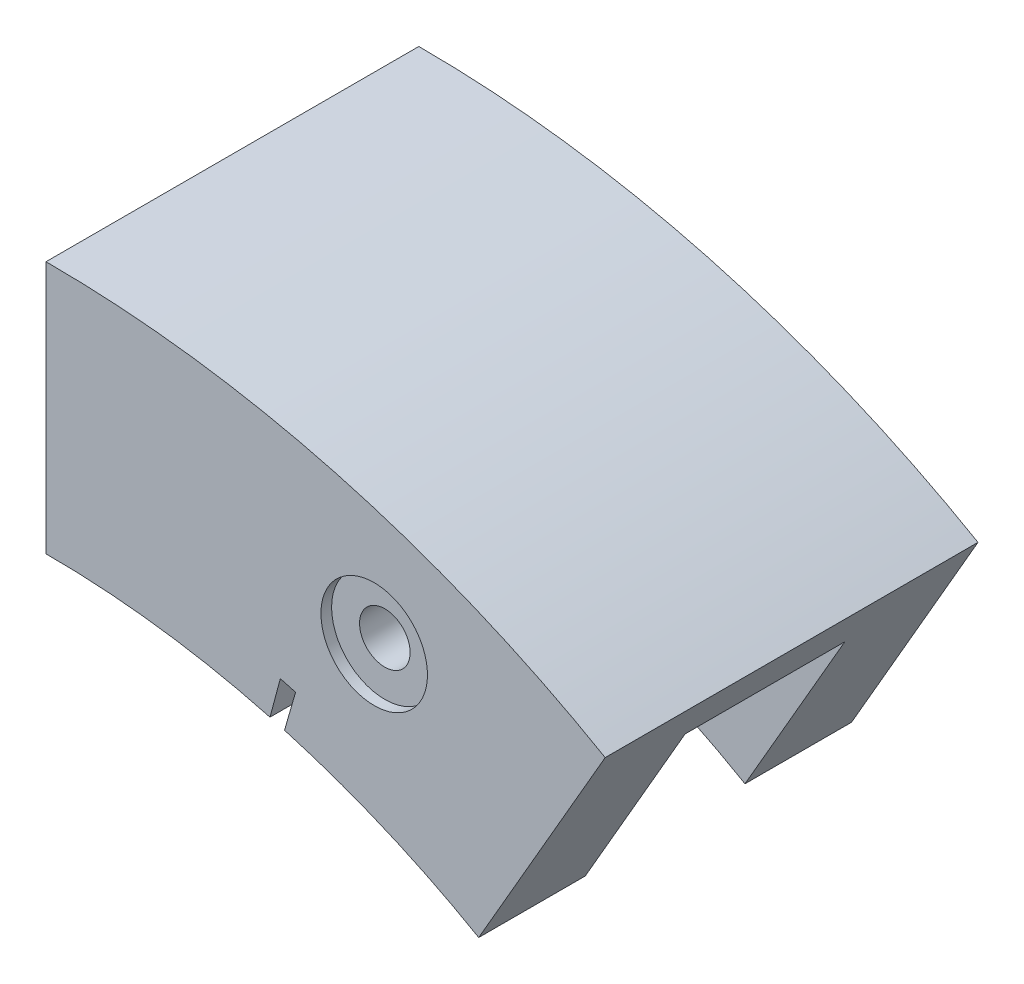
ISO-10303-21;
HEADER;
FILE_DESCRIPTION(('STEP AP214'),'2;1');
FILE_NAME('part.step','',(''),(''),'','','');
FILE_SCHEMA(('AUTOMOTIVE_DESIGN { 1 0 10303 214 1 1 1 1 }'));
ENDSEC;
DATA;
#1=APPLICATION_CONTEXT('core data for automotive mechanical design processes');
#2=APPLICATION_PROTOCOL_DEFINITION('international standard','automotive_design',2000,#1);
#3=PRODUCT_CONTEXT('',#1,'mechanical');
#4=PRODUCT('Part','Part','',(#3));
#5=PRODUCT_RELATED_PRODUCT_CATEGORY('part','',(#4));
#6=PRODUCT_DEFINITION_FORMATION('','',#4);
#7=PRODUCT_DEFINITION_CONTEXT('part definition',#1,'design');
#8=PRODUCT_DEFINITION('design','',#6,#7);
#9=PRODUCT_DEFINITION_SHAPE('','',#8);
#10=(LENGTH_UNIT() NAMED_UNIT(*) SI_UNIT(.MILLI.,.METRE.));
#11=(NAMED_UNIT(*) PLANE_ANGLE_UNIT() SI_UNIT($,.RADIAN.));
#12=(NAMED_UNIT(*) SI_UNIT($,.STERADIAN.) SOLID_ANGLE_UNIT());
#13=UNCERTAINTY_MEASURE_WITH_UNIT(LENGTH_MEASURE(1.E-05),#10,'distance_accuracy_value','');
#14=(GEOMETRIC_REPRESENTATION_CONTEXT(3) GLOBAL_UNCERTAINTY_ASSIGNED_CONTEXT((#13)) GLOBAL_UNIT_ASSIGNED_CONTEXT((#10,
#11,#12)) REPRESENTATION_CONTEXT('',''));
#15=CARTESIAN_POINT('',(0.,0.,0.));
#16=DIRECTION('',(0.,0.,1.));
#17=DIRECTION('',(1.,0.,0.));
#18=AXIS2_PLACEMENT_3D('',#15,#16,#17);
#19=CARTESIAN_POINT('',(0.,0.,0.));
#20=DIRECTION('',(0.,0.,-1.));
#21=DIRECTION('',(-1.,0.,0.));
#22=AXIS2_PLACEMENT_3D('',#19,#20,#21);
#23=CYLINDRICAL_SURFACE('',#22,16.25);
#24=CARTESIAN_POINT('',(0.,0.,1.5));
#25=DIRECTION('',(0.,0.,-1.));
#26=DIRECTION('',(0.,1.,0.));
#27=AXIS2_PLACEMENT_3D('',#24,#25,#26);
#28=CIRCLE('',#27,16.25);
#29=CARTESIAN_POINT('',(0.,16.25,1.5));
#30=VERTEX_POINT('',#29);
#31=CARTESIAN_POINT('',(4.20580948291597,15.6962946771974,1.5));
#32=VERTEX_POINT('',#31);
#33=EDGE_CURVE('E184',#30,#32,#28,.T.);
#34=ORIENTED_EDGE('',*,*,#33,.T.);
#35=DIRECTION('',(0.,0.,-1.));
#36=VECTOR('',#35,1.);
#37=CARTESIAN_POINT('',(4.20580948291597,15.6962946771974,3.5));
#38=LINE('',#37,#36);
#39=CARTESIAN_POINT('',(4.20580948291597,15.6962946771974,3.5));
#40=VERTEX_POINT('',#39);
#41=EDGE_CURVE('E291',#40,#32,#38,.T.);
#42=ORIENTED_EDGE('',*,*,#41,.F.);
#43=CARTESIAN_POINT('',(0.,0.,3.5));
#44=DIRECTION('',(0.,0.,-1.));
#45=DIRECTION('',(0.,1.,0.));
#46=AXIS2_PLACEMENT_3D('',#43,#44,#45);
#47=CIRCLE('',#46,16.25);
#48=CARTESIAN_POINT('',(0.,16.25,3.5));
#49=VERTEX_POINT('',#48);
#50=EDGE_CURVE('E176',#49,#40,#47,.T.);
#51=ORIENTED_EDGE('',*,*,#50,.F.);
#52=DIRECTION('',(0.,0.,1.));
#53=VECTOR('',#52,1.);
#54=CARTESIAN_POINT('',(0.,16.25,0.));
#55=LINE('',#54,#53);
#56=EDGE_CURVE('E190',#49,#30,#55,.F.);
#57=ORIENTED_EDGE('',*,*,#56,.T.);
#58=EDGE_LOOP('',(#34,#42,#51,#57));
#59=FACE_BOUND('',#58,.T.);
#60=ADVANCED_FACE('F37',(#59),#23,.F.);
#61=CARTESIAN_POINT('',(0.,0.,0.));
#62=DIRECTION('',(0.,0.,-1.));
#63=DIRECTION('',(-1.,0.,0.));
#64=AXIS2_PLACEMENT_3D('',#61,#62,#63);
#65=CYLINDRICAL_SURFACE('',#64,16.25);
#66=CARTESIAN_POINT('',(0.,0.,-3.5));
#67=DIRECTION('',(0.,0.,-1.));
#68=DIRECTION('',(0.,1.,0.));
#69=AXIS2_PLACEMENT_3D('',#66,#67,#68);
#70=CIRCLE('',#69,16.25);
#71=CARTESIAN_POINT('',(0.,16.25,-3.5));
#72=VERTEX_POINT('',#71);
#73=CARTESIAN_POINT('',(4.20580948291597,15.6962946771974,-3.5));
#74=VERTEX_POINT('',#73);
#75=EDGE_CURVE('E221',#72,#74,#70,.T.);
#76=ORIENTED_EDGE('',*,*,#75,.T.);
#77=CARTESIAN_POINT('',(4.20580948291597,15.6962946771974,-1.5));
#78=VERTEX_POINT('',#77);
#79=EDGE_CURVE('E52',#78,#74,#38,.T.);
#80=ORIENTED_EDGE('',*,*,#79,.F.);
#81=CARTESIAN_POINT('',(0.,0.,-1.5));
#82=DIRECTION('',(0.,0.,-1.));
#83=DIRECTION('',(0.,1.,0.));
#84=AXIS2_PLACEMENT_3D('',#81,#82,#83);
#85=CIRCLE('',#84,16.25);
#86=CARTESIAN_POINT('',(0.,16.25,-1.5));
#87=VERTEX_POINT('',#86);
#88=EDGE_CURVE('E211',#87,#78,#85,.T.);
#89=ORIENTED_EDGE('',*,*,#88,.F.);
#90=DIRECTION('',(0.,0.,1.));
#91=VECTOR('',#90,1.);
#92=CARTESIAN_POINT('',(0.,16.25,0.));
#93=LINE('',#92,#91);
#94=EDGE_CURVE('E207',#87,#72,#93,.F.);
#95=ORIENTED_EDGE('',*,*,#94,.T.);
#96=EDGE_LOOP('',(#76,#80,#89,#95));
#97=FACE_BOUND('',#96,.T.);
#98=ADVANCED_FACE('F255',(#97),#65,.F.);
#99=CARTESIAN_POINT('',(0.,0.,0.));
#100=DIRECTION('',(1.,0.,0.));
#101=DIRECTION('',(0.,0.,-1.));
#102=AXIS2_PLACEMENT_3D('',#99,#100,#101);
#103=PLANE('',#102);
#104=ORIENTED_EDGE('',*,*,#56,.F.);
#105=DIRECTION('',(0.,-1.,0.));
#106=VECTOR('',#105,1.);
#107=CARTESIAN_POINT('',(0.,0.,3.5));
#108=LINE('',#107,#106);
#109=CARTESIAN_POINT('',(0.,21.,3.5));
#110=VERTEX_POINT('',#109);
#111=EDGE_CURVE('E177',#110,#49,#108,.T.);
#112=ORIENTED_EDGE('',*,*,#111,.F.);
#113=DIRECTION('',(0.,0.,1.));
#114=VECTOR('',#113,1.);
#115=CARTESIAN_POINT('',(0.,21.,0.));
#116=LINE('',#115,#114);
#117=CARTESIAN_POINT('',(0.,21.,-3.5));
#118=VERTEX_POINT('',#117);
#119=EDGE_CURVE('E181',#118,#110,#116,.T.);
#120=ORIENTED_EDGE('',*,*,#119,.F.);
#121=DIRECTION('',(0.,-1.,0.));
#122=VECTOR('',#121,1.);
#123=CARTESIAN_POINT('',(0.,0.,-3.5));
#124=LINE('',#123,#122);
#125=EDGE_CURVE('E217',#72,#118,#124,.F.);
#126=ORIENTED_EDGE('',*,*,#125,.F.);
#127=ORIENTED_EDGE('',*,*,#94,.F.);
#128=DIRECTION('',(0.,1.,0.));
#129=VECTOR('',#128,1.);
#130=CARTESIAN_POINT('',(0.,0.,-1.5));
#131=LINE('',#130,#129);
#132=CARTESIAN_POINT('',(0.,20.,-1.5));
#133=VERTEX_POINT('',#132);
#134=EDGE_CURVE('E199',#133,#87,#131,.F.);
#135=ORIENTED_EDGE('',*,*,#134,.F.);
#136=DIRECTION('',(0.,0.,1.));
#137=VECTOR('',#136,1.);
#138=CARTESIAN_POINT('',(0.,20.,0.));
#139=LINE('',#138,#137);
#140=CARTESIAN_POINT('',(0.,20.,1.5));
#141=VERTEX_POINT('',#140);
#142=EDGE_CURVE('E189',#141,#133,#139,.F.);
#143=ORIENTED_EDGE('',*,*,#142,.F.);
#144=DIRECTION('',(0.,1.,0.));
#145=VECTOR('',#144,1.);
#146=CARTESIAN_POINT('',(0.,0.,1.5));
#147=LINE('',#146,#145);
#148=EDGE_CURVE('E186',#30,#141,#147,.T.);
#149=ORIENTED_EDGE('',*,*,#148,.F.);
#150=EDGE_LOOP('',(#104,#112,#120,#126,#127,#135,#143,#149));
#151=FACE_BOUND('',#150,.T.);
#152=ADVANCED_FACE('F39',(#151),#103,.F.);
#153=CARTESIAN_POINT('',(0.,0.,0.));
#154=DIRECTION('',(0.866025403784438,-0.500000000000001,0.));
#155=DIRECTION('',(0.,0.,-1.));
#156=AXIS2_PLACEMENT_3D('',#153,#154,#155);
#157=PLANE('',#156);
#158=DIRECTION('',(0.,0.,1.));
#159=VECTOR('',#158,1.);
#160=CARTESIAN_POINT('',(8.12500000000002,14.0729128114971,0.));
#161=LINE('',#160,#159);
#162=CARTESIAN_POINT('',(8.12500000000002,14.0729128114971,3.5));
#163=VERTEX_POINT('',#162);
#164=CARTESIAN_POINT('',(8.12500000000002,14.0729128114971,1.5));
#165=VERTEX_POINT('',#164);
#166=EDGE_CURVE('E175',#163,#165,#161,.F.);
#167=ORIENTED_EDGE('',*,*,#166,.T.);
#168=DIRECTION('',(0.500000000000001,0.866025403784438,0.));
#169=VECTOR('',#168,1.);
#170=CARTESIAN_POINT('',(0.,0.,1.5));
#171=LINE('',#170,#169);
#172=CARTESIAN_POINT('',(10.,17.3205080756888,1.5));
#173=VERTEX_POINT('',#172);
#174=EDGE_CURVE('E191',#165,#173,#171,.T.);
#175=ORIENTED_EDGE('',*,*,#174,.T.);
#176=DIRECTION('',(0.,0.,1.));
#177=VECTOR('',#176,1.);
#178=CARTESIAN_POINT('',(10.,17.3205080756888,0.));
#179=LINE('',#178,#177);
#180=CARTESIAN_POINT('',(10.,17.3205080756888,-1.5));
#181=VERTEX_POINT('',#180);
#182=EDGE_CURVE('E196',#173,#181,#179,.F.);
#183=ORIENTED_EDGE('',*,*,#182,.T.);
#184=DIRECTION('',(0.500000000000001,0.866025403784438,0.));
#185=VECTOR('',#184,1.);
#186=CARTESIAN_POINT('',(0.,0.,-1.5));
#187=LINE('',#186,#185);
#188=CARTESIAN_POINT('',(8.12500000000002,14.0729128114971,-1.5));
#189=VERTEX_POINT('',#188);
#190=EDGE_CURVE('E204',#181,#189,#187,.F.);
#191=ORIENTED_EDGE('',*,*,#190,.T.);
#192=DIRECTION('',(0.,0.,1.));
#193=VECTOR('',#192,1.);
#194=CARTESIAN_POINT('',(8.12500000000002,14.0729128114971,0.));
#195=LINE('',#194,#193);
#196=CARTESIAN_POINT('',(8.12500000000002,14.0729128114971,-3.5));
#197=VERTEX_POINT('',#196);
#198=EDGE_CURVE('E214',#189,#197,#195,.F.);
#199=ORIENTED_EDGE('',*,*,#198,.T.);
#200=DIRECTION('',(-0.500000000000001,-0.866025403784438,0.));
#201=VECTOR('',#200,1.);
#202=CARTESIAN_POINT('',(0.,0.,-3.5));
#203=LINE('',#202,#201);
#204=CARTESIAN_POINT('',(10.5,18.1865334794732,-3.5));
#205=VERTEX_POINT('',#204);
#206=EDGE_CURVE('E224',#197,#205,#203,.F.);
#207=ORIENTED_EDGE('',*,*,#206,.T.);
#208=DIRECTION('',(0.,0.,1.));
#209=VECTOR('',#208,1.);
#210=CARTESIAN_POINT('',(10.5,18.1865334794732,0.));
#211=LINE('',#210,#209);
#212=CARTESIAN_POINT('',(10.5,18.1865334794732,3.5));
#213=VERTEX_POINT('',#212);
#214=EDGE_CURVE('E231',#205,#213,#211,.T.);
#215=ORIENTED_EDGE('',*,*,#214,.T.);
#216=DIRECTION('',(-0.500000000000001,-0.866025403784438,0.));
#217=VECTOR('',#216,1.);
#218=CARTESIAN_POINT('',(0.,0.,3.5));
#219=LINE('',#218,#217);
#220=EDGE_CURVE('E11',#213,#163,#219,.T.);
#221=ORIENTED_EDGE('',*,*,#220,.T.);
#222=EDGE_LOOP('',(#167,#175,#183,#191,#199,#207,#215,#221));
#223=FACE_BOUND('',#222,.T.);
#224=ADVANCED_FACE('F243',(#223),#157,.T.);
#225=DIRECTION('',(0.,0.,-1.));
#226=VECTOR('',#225,1.);
#227=CARTESIAN_POINT('',(4.47910703202624,15.6205025589977,3.5));
#228=LINE('',#227,#226);
#229=CARTESIAN_POINT('',(4.47910703202624,15.6205025589977,3.5));
#230=VERTEX_POINT('',#229);
#231=CARTESIAN_POINT('',(4.47910703202624,15.6205025589977,1.5));
#232=VERTEX_POINT('',#231);
#233=EDGE_CURVE('E152',#230,#232,#228,.T.);
#234=ORIENTED_EDGE('',*,*,#233,.T.);
#235=EDGE_CURVE('E280',#232,#165,#28,.T.);
#236=ORIENTED_EDGE('',*,*,#235,.T.);
#237=ORIENTED_EDGE('',*,*,#166,.F.);
#238=EDGE_CURVE('E167',#230,#163,#47,.T.);
#239=ORIENTED_EDGE('',*,*,#238,.F.);
#240=EDGE_LOOP('',(#234,#236,#237,#239));
#241=FACE_BOUND('',#240,.T.);
#242=ADVANCED_FACE('F173',(#241),#23,.F.);
#243=CARTESIAN_POINT('',(0.,0.,1.5));
#244=DIRECTION('',(0.,0.,-1.));
#245=DIRECTION('',(-1.,0.,0.));
#246=AXIS2_PLACEMENT_3D('',#243,#244,#245);
#247=PLANE('',#246);
#248=CARTESIAN_POINT('',(6.16242312835612,17.8629681483451,1.5));
#249=DIRECTION('',(0.,0.,-1.));
#250=DIRECTION('',(-1.,0.,0.));
#251=AXIS2_PLACEMENT_3D('',#248,#249,#250);
#252=CIRCLE('',#251,0.475);
#253=CARTESIAN_POINT('',(5.68742312835612,17.8629681483451,1.5));
#254=VERTEX_POINT('',#253);
#255=EDGE_CURVE('E327',#254,#254,#252,.T.);
#256=ORIENTED_EDGE('',*,*,#255,.F.);
#257=EDGE_LOOP('',(#256));
#258=FACE_BOUND('',#257,.T.);
#259=DIRECTION('',(-0.275637355817,-0.961261695938319,0.));
#260=VECTOR('',#259,1.);
#261=CARTESIAN_POINT('',(0.,0.,1.5));
#262=LINE('',#261,#260);
#263=CARTESIAN_POINT('',(4.68583504888899,16.3414488309514,1.5));
#264=VERTEX_POINT('',#263);
#265=EDGE_CURVE('E158',#264,#232,#262,.T.);
#266=ORIENTED_EDGE('',*,*,#265,.F.);
#267=CARTESIAN_POINT('',(0.,0.,1.5));
#268=DIRECTION('',(0.,0.,-1.));
#269=DIRECTION('',(-1.,0.,0.));
#270=AXIS2_PLACEMENT_3D('',#267,#268,#269);
#271=CIRCLE('',#270,17.);
#272=CARTESIAN_POINT('',(4.39992376674287,16.4207390469142,1.5));
#273=VERTEX_POINT('',#272);
#274=EDGE_CURVE('E282',#273,#264,#271,.T.);
#275=ORIENTED_EDGE('',*,*,#274,.F.);
#276=DIRECTION('',(-0.258819045102522,-0.965925826289068,0.));
#277=VECTOR('',#276,1.);
#278=CARTESIAN_POINT('',(0.,0.,1.5));
#279=LINE('',#278,#277);
#280=EDGE_CURVE('E283',#273,#32,#279,.T.);
#281=ORIENTED_EDGE('',*,*,#280,.T.);
#282=ORIENTED_EDGE('',*,*,#33,.F.);
#283=ORIENTED_EDGE('',*,*,#148,.T.);
#284=CARTESIAN_POINT('',(0.,0.,1.5));
#285=DIRECTION('',(0.,0.,-1.));
#286=DIRECTION('',(0.,1.,0.));
#287=AXIS2_PLACEMENT_3D('',#284,#285,#286);
#288=CIRCLE('',#287,20.);
#289=EDGE_CURVE('E193',#141,#173,#288,.T.);
#290=ORIENTED_EDGE('',*,*,#289,.T.);
#291=ORIENTED_EDGE('',*,*,#174,.F.);
#292=ORIENTED_EDGE('',*,*,#235,.F.);
#293=EDGE_LOOP('',(#266,#275,#281,#282,#283,#290,#291,#292));
#294=FACE_BOUND('',#293,.T.);
#295=ADVANCED_FACE('F269',(#258,#294),#247,.T.);
#296=CARTESIAN_POINT('',(0.,0.,0.));
#297=DIRECTION('',(0.,0.,-1.));
#298=DIRECTION('',(-1.,0.,0.));
#299=AXIS2_PLACEMENT_3D('',#296,#297,#298);
#300=CYLINDRICAL_SURFACE('',#299,20.);
#301=CARTESIAN_POINT('',(0.,0.,-1.5));
#302=DIRECTION('',(0.,0.,-1.));
#303=DIRECTION('',(0.,1.,0.));
#304=AXIS2_PLACEMENT_3D('',#301,#302,#303);
#305=CIRCLE('',#304,20.);
#306=EDGE_CURVE('E201',#133,#181,#305,.T.);
#307=ORIENTED_EDGE('',*,*,#306,.T.);
#308=ORIENTED_EDGE('',*,*,#182,.F.);
#309=ORIENTED_EDGE('',*,*,#289,.F.);
#310=ORIENTED_EDGE('',*,*,#142,.T.);
#311=EDGE_LOOP('',(#307,#308,#309,#310));
#312=FACE_BOUND('',#311,.T.);
#313=ADVANCED_FACE('F266',(#312),#300,.F.);
#314=CARTESIAN_POINT('',(0.,0.,-1.5));
#315=DIRECTION('',(0.,0.,1.));
#316=DIRECTION('',(1.,0.,0.));
#317=AXIS2_PLACEMENT_3D('',#314,#315,#316);
#318=PLANE('',#317);
#319=CARTESIAN_POINT('',(6.16242312835612,17.8629681483451,-1.5));
#320=DIRECTION('',(0.,0.,1.));
#321=DIRECTION('',(1.,0.,0.));
#322=AXIS2_PLACEMENT_3D('',#319,#320,#321);
#323=CIRCLE('',#322,0.474999999999999);
#324=CARTESIAN_POINT('',(6.63742312835612,17.8629681483451,-1.5));
#325=VERTEX_POINT('',#324);
#326=EDGE_CURVE('E315',#325,#325,#323,.T.);
#327=ORIENTED_EDGE('',*,*,#326,.F.);
#328=EDGE_LOOP('',(#327));
#329=FACE_BOUND('',#328,.T.);
#330=DIRECTION('',(0.275637355817,0.961261695938319,0.));
#331=VECTOR('',#330,1.);
#332=CARTESIAN_POINT('',(0.,0.,-1.5));
#333=LINE('',#332,#331);
#334=CARTESIAN_POINT('',(4.47910703202624,15.6205025589977,-1.5));
#335=VERTEX_POINT('',#334);
#336=CARTESIAN_POINT('',(4.68583504888899,16.3414488309514,-1.5));
#337=VERTEX_POINT('',#336);
#338=EDGE_CURVE('E277',#335,#337,#333,.T.);
#339=ORIENTED_EDGE('',*,*,#338,.F.);
#340=EDGE_CURVE('E210',#335,#189,#85,.T.);
#341=ORIENTED_EDGE('',*,*,#340,.T.);
#342=ORIENTED_EDGE('',*,*,#190,.F.);
#343=ORIENTED_EDGE('',*,*,#306,.F.);
#344=ORIENTED_EDGE('',*,*,#134,.T.);
#345=ORIENTED_EDGE('',*,*,#88,.T.);
#346=DIRECTION('',(0.258819045102522,0.965925826289068,0.));
#347=VECTOR('',#346,1.);
#348=CARTESIAN_POINT('',(0.,0.,-1.5));
#349=LINE('',#348,#347);
#350=CARTESIAN_POINT('',(4.39992376674287,16.4207390469142,-1.5));
#351=VERTEX_POINT('',#350);
#352=EDGE_CURVE('E261',#78,#351,#349,.T.);
#353=ORIENTED_EDGE('',*,*,#352,.T.);
#354=CARTESIAN_POINT('',(0.,0.,-1.5));
#355=DIRECTION('',(0.,0.,1.));
#356=DIRECTION('',(1.,0.,0.));
#357=AXIS2_PLACEMENT_3D('',#354,#355,#356);
#358=CIRCLE('',#357,17.);
#359=EDGE_CURVE('E284',#337,#351,#358,.T.);
#360=ORIENTED_EDGE('',*,*,#359,.F.);
#361=EDGE_LOOP('',(#339,#341,#342,#343,#344,#345,#353,#360));
#362=FACE_BOUND('',#361,.T.);
#363=ADVANCED_FACE('F259',(#329,#362),#318,.T.);
#364=CARTESIAN_POINT('',(4.47910703202624,15.6205025589977,-3.5));
#365=VERTEX_POINT('',#364);
#366=EDGE_CURVE('E162',#335,#365,#228,.T.);
#367=ORIENTED_EDGE('',*,*,#366,.T.);
#368=EDGE_CURVE('E220',#365,#197,#70,.T.);
#369=ORIENTED_EDGE('',*,*,#368,.T.);
#370=ORIENTED_EDGE('',*,*,#198,.F.);
#371=ORIENTED_EDGE('',*,*,#340,.F.);
#372=EDGE_LOOP('',(#367,#369,#370,#371));
#373=FACE_BOUND('',#372,.T.);
#374=ADVANCED_FACE('F346',(#373),#65,.F.);
#375=CARTESIAN_POINT('',(0.,0.,-3.5));
#376=DIRECTION('',(0.,0.,-1.));
#377=DIRECTION('',(-1.,0.,0.));
#378=AXIS2_PLACEMENT_3D('',#375,#376,#377);
#379=PLANE('',#378);
#380=CARTESIAN_POINT('',(6.16242312835612,17.8629681483451,-3.5));
#381=DIRECTION('',(0.,0.,-1.));
#382=DIRECTION('',(-1.,0.,0.));
#383=AXIS2_PLACEMENT_3D('',#380,#381,#382);
#384=CIRCLE('',#383,1.);
#385=CARTESIAN_POINT('',(5.16242312835612,17.8629681483451,-3.5));
#386=VERTEX_POINT('',#385);
#387=EDGE_CURVE('E307',#386,#386,#384,.T.);
#388=ORIENTED_EDGE('',*,*,#387,.F.);
#389=EDGE_LOOP('',(#388));
#390=FACE_BOUND('',#389,.T.);
#391=DIRECTION('',(-0.275637355817,-0.961261695938319,0.));
#392=VECTOR('',#391,1.);
#393=CARTESIAN_POINT('',(0.,0.,-3.5));
#394=LINE('',#393,#392);
#395=CARTESIAN_POINT('',(4.68583504888899,16.3414488309514,-3.5));
#396=VERTEX_POINT('',#395);
#397=EDGE_CURVE('E302',#396,#365,#394,.T.);
#398=ORIENTED_EDGE('',*,*,#397,.F.);
#399=CARTESIAN_POINT('',(0.,0.,-3.5));
#400=DIRECTION('',(0.,0.,-1.));
#401=DIRECTION('',(-1.,0.,0.));
#402=AXIS2_PLACEMENT_3D('',#399,#400,#401);
#403=CIRCLE('',#402,17.);
#404=CARTESIAN_POINT('',(4.39992376674287,16.4207390469142,-3.5));
#405=VERTEX_POINT('',#404);
#406=EDGE_CURVE('E170',#405,#396,#403,.T.);
#407=ORIENTED_EDGE('',*,*,#406,.F.);
#408=DIRECTION('',(-0.258819045102522,-0.965925826289068,0.));
#409=VECTOR('',#408,1.);
#410=CARTESIAN_POINT('',(0.,0.,-3.5));
#411=LINE('',#410,#409);
#412=EDGE_CURVE('E300',#405,#74,#411,.T.);
#413=ORIENTED_EDGE('',*,*,#412,.T.);
#414=ORIENTED_EDGE('',*,*,#75,.F.);
#415=ORIENTED_EDGE('',*,*,#125,.T.);
#416=CARTESIAN_POINT('',(0.,0.,-3.5));
#417=DIRECTION('',(0.,0.,-1.));
#418=DIRECTION('',(0.,1.,0.));
#419=AXIS2_PLACEMENT_3D('',#416,#417,#418);
#420=CIRCLE('',#419,21.);
#421=EDGE_CURVE('E228',#118,#205,#420,.T.);
#422=ORIENTED_EDGE('',*,*,#421,.T.);
#423=ORIENTED_EDGE('',*,*,#206,.F.);
#424=ORIENTED_EDGE('',*,*,#368,.F.);
#425=EDGE_LOOP('',(#398,#407,#413,#414,#415,#422,#423,#424));
#426=FACE_BOUND('',#425,.T.);
#427=ADVANCED_FACE('F250',(#390,#426),#379,.T.);
#428=CARTESIAN_POINT('',(0.,0.,0.));
#429=DIRECTION('',(0.,0.,-1.));
#430=DIRECTION('',(-1.,0.,0.));
#431=AXIS2_PLACEMENT_3D('',#428,#429,#430);
#432=CYLINDRICAL_SURFACE('',#431,21.);
#433=CARTESIAN_POINT('',(0.,0.,3.5));
#434=DIRECTION('',(0.,0.,-1.));
#435=DIRECTION('',(0.,1.,0.));
#436=AXIS2_PLACEMENT_3D('',#433,#434,#435);
#437=CIRCLE('',#436,21.);
#438=EDGE_CURVE('E45',#110,#213,#437,.T.);
#439=ORIENTED_EDGE('',*,*,#438,.T.);
#440=ORIENTED_EDGE('',*,*,#214,.F.);
#441=ORIENTED_EDGE('',*,*,#421,.F.);
#442=ORIENTED_EDGE('',*,*,#119,.T.);
#443=EDGE_LOOP('',(#439,#440,#441,#442));
#444=FACE_BOUND('',#443,.T.);
#445=ADVANCED_FACE('F239',(#444),#432,.T.);
#446=CARTESIAN_POINT('',(0.,0.,3.5));
#447=DIRECTION('',(0.,0.,1.));
#448=DIRECTION('',(1.,0.,0.));
#449=AXIS2_PLACEMENT_3D('',#446,#447,#448);
#450=PLANE('',#449);
#451=CARTESIAN_POINT('',(6.16242312835612,17.8629681483451,3.5));
#452=DIRECTION('',(0.,0.,-1.));
#453=DIRECTION('',(-1.,0.,0.));
#454=AXIS2_PLACEMENT_3D('',#451,#452,#453);
#455=CIRCLE('',#454,1.);
#456=CARTESIAN_POINT('',(5.16242312835612,17.8629681483451,3.5));
#457=VERTEX_POINT('',#456);
#458=EDGE_CURVE('E319',#457,#457,#455,.T.);
#459=ORIENTED_EDGE('',*,*,#458,.T.);
#460=EDGE_LOOP('',(#459));
#461=FACE_BOUND('',#460,.T.);
#462=DIRECTION('',(-0.275637355817,-0.961261695938319,0.));
#463=VECTOR('',#462,1.);
#464=CARTESIAN_POINT('',(0.,0.,3.5));
#465=LINE('',#464,#463);
#466=CARTESIAN_POINT('',(4.68583504888899,16.3414488309514,3.5));
#467=VERTEX_POINT('',#466);
#468=EDGE_CURVE('E156',#467,#230,#465,.T.);
#469=ORIENTED_EDGE('',*,*,#468,.T.);
#470=ORIENTED_EDGE('',*,*,#238,.T.);
#471=ORIENTED_EDGE('',*,*,#220,.F.);
#472=ORIENTED_EDGE('',*,*,#438,.F.);
#473=ORIENTED_EDGE('',*,*,#111,.T.);
#474=ORIENTED_EDGE('',*,*,#50,.T.);
#475=DIRECTION('',(-0.258819045102522,-0.965925826289068,0.));
#476=VECTOR('',#475,1.);
#477=CARTESIAN_POINT('',(0.,0.,3.5));
#478=LINE('',#477,#476);
#479=CARTESIAN_POINT('',(4.39992376674287,16.4207390469142,3.5));
#480=VERTEX_POINT('',#479);
#481=EDGE_CURVE('E169',#480,#40,#478,.T.);
#482=ORIENTED_EDGE('',*,*,#481,.F.);
#483=CARTESIAN_POINT('',(0.,0.,3.5));
#484=DIRECTION('',(0.,0.,-1.));
#485=DIRECTION('',(-1.,0.,0.));
#486=AXIS2_PLACEMENT_3D('',#483,#484,#485);
#487=CIRCLE('',#486,17.);
#488=EDGE_CURVE('E60',#480,#467,#487,.T.);
#489=ORIENTED_EDGE('',*,*,#488,.T.);
#490=EDGE_LOOP('',(#469,#470,#471,#472,#473,#474,#482,#489));
#491=FACE_BOUND('',#490,.T.);
#492=ADVANCED_FACE('F165',(#461,#491),#450,.T.);
#493=CARTESIAN_POINT('',(0.,0.,3.5));
#494=DIRECTION('',(0.965925826289068,-0.258819045102522,0.));
#495=DIRECTION('',(0.258819045102522,0.965925826289068,0.));
#496=AXIS2_PLACEMENT_3D('',#493,#494,#495);
#497=PLANE('',#496);
#498=DIRECTION('',(0.,0.,-1.));
#499=VECTOR('',#498,1.);
#500=CARTESIAN_POINT('',(4.39992376674287,16.4207390469142,3.5));
#501=LINE('',#500,#499);
#502=EDGE_CURVE('E294',#480,#273,#501,.T.);
#503=ORIENTED_EDGE('',*,*,#502,.F.);
#504=ORIENTED_EDGE('',*,*,#481,.T.);
#505=ORIENTED_EDGE('',*,*,#41,.T.);
#506=ORIENTED_EDGE('',*,*,#280,.F.);
#507=EDGE_LOOP('',(#503,#504,#505,#506));
#508=FACE_BOUND('',#507,.T.);
#509=ADVANCED_FACE('F357',(#508),#497,.T.);
#510=CARTESIAN_POINT('',(0.,0.,3.5));
#511=DIRECTION('',(0.,0.,-1.));
#512=DIRECTION('',(-1.,0.,0.));
#513=AXIS2_PLACEMENT_3D('',#510,#511,#512);
#514=CYLINDRICAL_SURFACE('',#513,17.);
#515=ORIENTED_EDGE('',*,*,#274,.T.);
#516=DIRECTION('',(0.,0.,-1.));
#517=VECTOR('',#516,1.);
#518=CARTESIAN_POINT('',(4.68583504888899,16.3414488309514,3.5));
#519=LINE('',#518,#517);
#520=EDGE_CURVE('E289',#467,#264,#519,.T.);
#521=ORIENTED_EDGE('',*,*,#520,.F.);
#522=ORIENTED_EDGE('',*,*,#488,.F.);
#523=ORIENTED_EDGE('',*,*,#502,.T.);
#524=EDGE_LOOP('',(#515,#521,#522,#523));
#525=FACE_BOUND('',#524,.T.);
#526=ADVANCED_FACE('F361',(#525),#514,.F.);
#527=CARTESIAN_POINT('',(0.,0.,3.5));
#528=DIRECTION('',(0.961261695938319,-0.275637355817,0.));
#529=DIRECTION('',(0.275637355817,0.961261695938319,0.));
#530=AXIS2_PLACEMENT_3D('',#527,#528,#529);
#531=PLANE('',#530);
#532=ORIENTED_EDGE('',*,*,#265,.T.);
#533=ORIENTED_EDGE('',*,*,#233,.F.);
#534=ORIENTED_EDGE('',*,*,#468,.F.);
#535=ORIENTED_EDGE('',*,*,#520,.T.);
#536=EDGE_LOOP('',(#532,#533,#534,#535));
#537=FACE_BOUND('',#536,.T.);
#538=ADVANCED_FACE('F154',(#537),#531,.F.);
#539=ORIENTED_EDGE('',*,*,#338,.T.);
#540=EDGE_CURVE('E296',#337,#396,#519,.T.);
#541=ORIENTED_EDGE('',*,*,#540,.T.);
#542=ORIENTED_EDGE('',*,*,#397,.T.);
#543=ORIENTED_EDGE('',*,*,#366,.F.);
#544=EDGE_LOOP('',(#539,#541,#542,#543));
#545=FACE_BOUND('',#544,.T.);
#546=ADVANCED_FACE('F348',(#545),#531,.F.);
#547=ORIENTED_EDGE('',*,*,#359,.T.);
#548=EDGE_CURVE('E293',#351,#405,#501,.T.);
#549=ORIENTED_EDGE('',*,*,#548,.T.);
#550=ORIENTED_EDGE('',*,*,#406,.T.);
#551=ORIENTED_EDGE('',*,*,#540,.F.);
#552=EDGE_LOOP('',(#547,#549,#550,#551));
#553=FACE_BOUND('',#552,.T.);
#554=ADVANCED_FACE('F351',(#553),#514,.F.);
#555=ORIENTED_EDGE('',*,*,#79,.T.);
#556=ORIENTED_EDGE('',*,*,#412,.F.);
#557=ORIENTED_EDGE('',*,*,#548,.F.);
#558=ORIENTED_EDGE('',*,*,#352,.F.);
#559=EDGE_LOOP('',(#555,#556,#557,#558));
#560=FACE_BOUND('',#559,.T.);
#561=ADVANCED_FACE('F353',(#560),#497,.T.);
#562=CARTESIAN_POINT('',(6.16242312835612,17.8629681483451,-3.3));
#563=DIRECTION('',(0.,0.,-1.));
#564=DIRECTION('',(-1.,0.,0.));
#565=AXIS2_PLACEMENT_3D('',#562,#563,#564);
#566=CYLINDRICAL_SURFACE('',#565,1.);
#567=CARTESIAN_POINT('',(6.16242312835612,17.8629681483451,-3.3));
#568=DIRECTION('',(0.,0.,-1.));
#569=DIRECTION('',(-1.,0.,0.));
#570=AXIS2_PLACEMENT_3D('',#567,#568,#569);
#571=CIRCLE('',#570,1.);
#572=CARTESIAN_POINT('',(5.16242312835612,17.8629681483451,-3.3));
#573=VERTEX_POINT('',#572);
#574=EDGE_CURVE('E304',#573,#573,#571,.T.);
#575=ORIENTED_EDGE('',*,*,#574,.F.);
#576=EDGE_LOOP('',(#575));
#577=FACE_BOUND('',#576,.T.);
#578=ORIENTED_EDGE('',*,*,#387,.T.);
#579=EDGE_LOOP('',(#578));
#580=FACE_BOUND('',#579,.T.);
#581=ADVANCED_FACE('F356',(#577,#580),#566,.F.);
#582=CARTESIAN_POINT('',(0.,0.,-3.3));
#583=DIRECTION('',(0.,0.,-1.));
#584=DIRECTION('',(-1.,0.,0.));
#585=AXIS2_PLACEMENT_3D('',#582,#583,#584);
#586=PLANE('',#585);
#587=CARTESIAN_POINT('',(6.16242312835612,17.8629681483451,-3.3));
#588=DIRECTION('',(0.,0.,-1.));
#589=DIRECTION('',(-1.,0.,0.));
#590=AXIS2_PLACEMENT_3D('',#587,#588,#589);
#591=CIRCLE('',#590,0.474999999999999);
#592=CARTESIAN_POINT('',(5.68742312835612,17.8629681483451,-3.3));
#593=VERTEX_POINT('',#592);
#594=EDGE_CURVE('E310',#593,#593,#591,.T.);
#595=ORIENTED_EDGE('',*,*,#594,.F.);
#596=EDGE_LOOP('',(#595));
#597=FACE_BOUND('',#596,.T.);
#598=ORIENTED_EDGE('',*,*,#574,.T.);
#599=EDGE_LOOP('',(#598));
#600=FACE_BOUND('',#599,.T.);
#601=ADVANCED_FACE('F364',(#597,#600),#586,.T.);
#602=CARTESIAN_POINT('',(6.16242312835612,17.8629681483451,-3.5));
#603=DIRECTION('',(0.,0.,-1.));
#604=DIRECTION('',(-1.,0.,0.));
#605=AXIS2_PLACEMENT_3D('',#602,#603,#604);
#606=CYLINDRICAL_SURFACE('',#605,0.474999999999999);
#607=ORIENTED_EDGE('',*,*,#594,.T.);
#608=EDGE_LOOP('',(#607));
#609=FACE_BOUND('',#608,.T.);
#610=ORIENTED_EDGE('',*,*,#326,.T.);
#611=EDGE_LOOP('',(#610));
#612=FACE_BOUND('',#611,.T.);
#613=ADVANCED_FACE('F368',(#609,#612),#606,.F.);
#614=CARTESIAN_POINT('',(6.16242312835612,17.8629681483451,3.3));
#615=DIRECTION('',(0.,0.,1.));
#616=DIRECTION('',(1.,0.,0.));
#617=AXIS2_PLACEMENT_3D('',#614,#615,#616);
#618=CYLINDRICAL_SURFACE('',#617,1.);
#619=CARTESIAN_POINT('',(6.16242312835612,17.8629681483451,3.3));
#620=DIRECTION('',(0.,0.,-1.));
#621=DIRECTION('',(-1.,0.,0.));
#622=AXIS2_PLACEMENT_3D('',#619,#620,#621);
#623=CIRCLE('',#622,1.);
#624=CARTESIAN_POINT('',(5.16242312835612,17.8629681483451,3.3));
#625=VERTEX_POINT('',#624);
#626=EDGE_CURVE('E318',#625,#625,#623,.T.);
#627=ORIENTED_EDGE('',*,*,#626,.T.);
#628=EDGE_LOOP('',(#627));
#629=FACE_BOUND('',#628,.T.);
#630=ORIENTED_EDGE('',*,*,#458,.F.);
#631=EDGE_LOOP('',(#630));
#632=FACE_BOUND('',#631,.T.);
#633=ADVANCED_FACE('F372',(#629,#632),#618,.F.);
#634=CARTESIAN_POINT('',(0.,0.,3.3));
#635=DIRECTION('',(0.,0.,1.));
#636=DIRECTION('',(-1.,0.,0.));
#637=AXIS2_PLACEMENT_3D('',#634,#635,#636);
#638=PLANE('',#637);
#639=CARTESIAN_POINT('',(6.16242312835612,17.8629681483451,3.3));
#640=DIRECTION('',(0.,0.,1.));
#641=DIRECTION('',(1.,0.,0.));
#642=AXIS2_PLACEMENT_3D('',#639,#640,#641);
#643=CIRCLE('',#642,0.475);
#644=CARTESIAN_POINT('',(6.63742312835612,17.8629681483451,3.3));
#645=VERTEX_POINT('',#644);
#646=EDGE_CURVE('E322',#645,#645,#643,.T.);
#647=ORIENTED_EDGE('',*,*,#646,.F.);
#648=EDGE_LOOP('',(#647));
#649=FACE_BOUND('',#648,.T.);
#650=ORIENTED_EDGE('',*,*,#626,.F.);
#651=EDGE_LOOP('',(#650));
#652=FACE_BOUND('',#651,.T.);
#653=ADVANCED_FACE('F376',(#649,#652),#638,.T.);
#654=CARTESIAN_POINT('',(6.16242312835612,17.8629681483451,3.5));
#655=DIRECTION('',(0.,0.,1.));
#656=DIRECTION('',(1.,0.,0.));
#657=AXIS2_PLACEMENT_3D('',#654,#655,#656);
#658=CYLINDRICAL_SURFACE('',#657,0.475);
#659=ORIENTED_EDGE('',*,*,#646,.T.);
#660=EDGE_LOOP('',(#659));
#661=FACE_BOUND('',#660,.T.);
#662=ORIENTED_EDGE('',*,*,#255,.T.);
#663=EDGE_LOOP('',(#662));
#664=FACE_BOUND('',#663,.T.);
#665=ADVANCED_FACE('F331',(#661,#664),#658,.F.);
#666=CLOSED_SHELL('',(#60,#98,#152,#224,#242,#295,#313,#363,#374,#427,#445,#492,#509,#526,#538,
#546,#554,#561,#581,#601,#613,#633,#653,#665));
#667=MANIFOLD_SOLID_BREP('B2',#666);
#668=ADVANCED_BREP_SHAPE_REPRESENTATION('',(#18,#667),#14);
#669=SHAPE_DEFINITION_REPRESENTATION(#9,#668);
ENDSEC;
END-ISO-10303-21;
